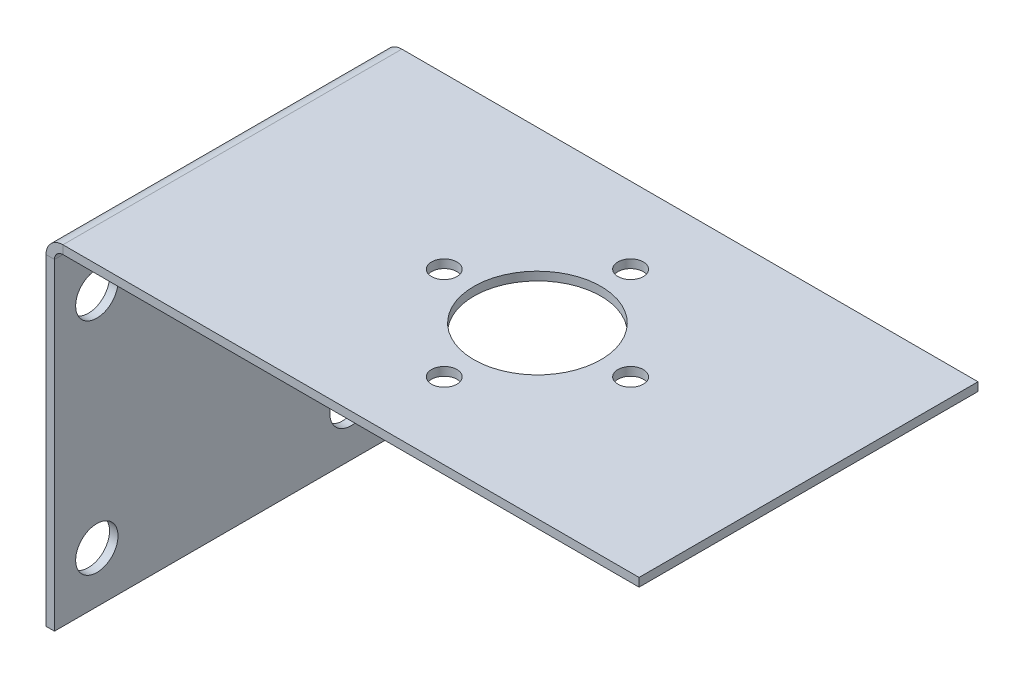
ISO-10303-21;
HEADER;
FILE_DESCRIPTION(('STEP AP214'),'2;1');
FILE_NAME('part.step','',(''),(''),'','','');
FILE_SCHEMA(('AUTOMOTIVE_DESIGN { 1 0 10303 214 1 1 1 1 }'));
ENDSEC;
DATA;
#1=APPLICATION_CONTEXT('core data for automotive mechanical design processes');
#2=APPLICATION_PROTOCOL_DEFINITION('international standard','automotive_design',2000,#1);
#3=PRODUCT_CONTEXT('',#1,'mechanical');
#4=PRODUCT('Part','Part','',(#3));
#5=PRODUCT_RELATED_PRODUCT_CATEGORY('part','',(#4));
#6=PRODUCT_DEFINITION_FORMATION('','',#4);
#7=PRODUCT_DEFINITION_CONTEXT('part definition',#1,'design');
#8=PRODUCT_DEFINITION('design','',#6,#7);
#9=PRODUCT_DEFINITION_SHAPE('','',#8);
#10=(LENGTH_UNIT() NAMED_UNIT(*) SI_UNIT(.MILLI.,.METRE.));
#11=(NAMED_UNIT(*) PLANE_ANGLE_UNIT() SI_UNIT($,.RADIAN.));
#12=(NAMED_UNIT(*) SI_UNIT($,.STERADIAN.) SOLID_ANGLE_UNIT());
#13=UNCERTAINTY_MEASURE_WITH_UNIT(LENGTH_MEASURE(1.E-05),#10,'distance_accuracy_value','');
#14=(GEOMETRIC_REPRESENTATION_CONTEXT(3) GLOBAL_UNCERTAINTY_ASSIGNED_CONTEXT((#13)) GLOBAL_UNIT_ASSIGNED_CONTEXT((#10,
#11,#12)) REPRESENTATION_CONTEXT('',''));
#15=CARTESIAN_POINT('',(0.,0.,0.));
#16=DIRECTION('',(0.,0.,1.));
#17=DIRECTION('',(1.,0.,0.));
#18=AXIS2_PLACEMENT_3D('',#15,#16,#17);
#19=CARTESIAN_POINT('',(2.,40.,40.));
#20=DIRECTION('',(0.,0.,1.));
#21=DIRECTION('',(1.,0.,0.));
#22=AXIS2_PLACEMENT_3D('',#19,#20,#21);
#23=PLANE('',#22);
#24=DIRECTION('',(0.,-1.,0.));
#25=VECTOR('',#24,1.);
#26=CARTESIAN_POINT('',(2.,40.,40.));
#27=LINE('',#26,#25);
#28=CARTESIAN_POINT('',(2.,40.,40.));
#29=VERTEX_POINT('',#28);
#30=CARTESIAN_POINT('',(2.,39.,40.));
#31=VERTEX_POINT('',#30);
#32=EDGE_CURVE('E11',#29,#31,#27,.T.);
#33=ORIENTED_EDGE('',*,*,#32,.F.);
#34=CARTESIAN_POINT('',(2.,38.,40.));
#35=DIRECTION('',(0.,0.,1.));
#36=DIRECTION('',(1.,0.,0.));
#37=AXIS2_PLACEMENT_3D('',#34,#35,#36);
#38=CIRCLE('',#37,2.);
#39=CARTESIAN_POINT('',(0.,38.,40.));
#40=VERTEX_POINT('',#39);
#41=EDGE_CURVE('E139',#40,#29,#38,.F.);
#42=ORIENTED_EDGE('',*,*,#41,.F.);
#43=DIRECTION('',(-1.,0.,0.));
#44=VECTOR('',#43,1.);
#45=CARTESIAN_POINT('',(1.,38.,40.));
#46=LINE('',#45,#44);
#47=CARTESIAN_POINT('',(1.,38.,40.));
#48=VERTEX_POINT('',#47);
#49=EDGE_CURVE('E50',#48,#40,#46,.T.);
#50=ORIENTED_EDGE('',*,*,#49,.F.);
#51=CARTESIAN_POINT('',(2.,38.,40.));
#52=DIRECTION('',(0.,0.,1.));
#53=DIRECTION('',(1.,0.,0.));
#54=AXIS2_PLACEMENT_3D('',#51,#52,#53);
#55=CIRCLE('',#54,1.);
#56=EDGE_CURVE('E132',#48,#31,#55,.F.);
#57=ORIENTED_EDGE('',*,*,#56,.T.);
#58=EDGE_LOOP('',(#33,#42,#50,#57));
#59=FACE_BOUND('',#58,.T.);
#60=ADVANCED_FACE('F42',(#59),#23,.T.);
#61=CARTESIAN_POINT('',(1.,38.,40.));
#62=DIRECTION('',(0.,0.,1.));
#63=DIRECTION('',(1.,0.,0.));
#64=AXIS2_PLACEMENT_3D('',#61,#62,#63);
#65=PLANE('',#64);
#66=DIRECTION('',(1.,0.,0.));
#67=VECTOR('',#66,1.);
#68=CARTESIAN_POINT('',(0.,40.,40.));
#69=LINE('',#68,#67);
#70=CARTESIAN_POINT('',(70.,40.,40.));
#71=VERTEX_POINT('',#70);
#72=EDGE_CURVE('E189',#29,#71,#69,.T.);
#73=ORIENTED_EDGE('',*,*,#72,.F.);
#74=ORIENTED_EDGE('',*,*,#32,.T.);
#75=DIRECTION('',(1.,0.,0.));
#76=VECTOR('',#75,1.);
#77=CARTESIAN_POINT('',(0.,39.,40.));
#78=LINE('',#77,#76);
#79=CARTESIAN_POINT('',(70.,39.,40.));
#80=VERTEX_POINT('',#79);
#81=EDGE_CURVE('E98',#31,#80,#78,.T.);
#82=ORIENTED_EDGE('',*,*,#81,.T.);
#83=DIRECTION('',(0.,-1.,0.));
#84=VECTOR('',#83,1.);
#85=CARTESIAN_POINT('',(70.,40.,40.));
#86=LINE('',#85,#84);
#87=EDGE_CURVE('E505',#71,#80,#86,.T.);
#88=ORIENTED_EDGE('',*,*,#87,.F.);
#89=EDGE_LOOP('',(#73,#74,#82,#88));
#90=FACE_BOUND('',#89,.T.);
#91=ADVANCED_FACE('F197',(#90),#65,.T.);
#92=CARTESIAN_POINT('',(0.,38.,0.));
#93=DIRECTION('',(0.,0.,-1.));
#94=DIRECTION('',(-1.,0.,0.));
#95=AXIS2_PLACEMENT_3D('',#92,#93,#94);
#96=PLANE('',#95);
#97=DIRECTION('',(1.,0.,0.));
#98=VECTOR('',#97,1.);
#99=CARTESIAN_POINT('',(0.,38.,0.));
#100=LINE('',#99,#98);
#101=CARTESIAN_POINT('',(0.,38.,0.));
#102=VERTEX_POINT('',#101);
#103=CARTESIAN_POINT('',(1.,38.,0.));
#104=VERTEX_POINT('',#103);
#105=EDGE_CURVE('E85',#102,#104,#100,.T.);
#106=ORIENTED_EDGE('',*,*,#105,.F.);
#107=CARTESIAN_POINT('',(2.,38.,0.));
#108=DIRECTION('',(0.,0.,1.));
#109=DIRECTION('',(1.,0.,0.));
#110=AXIS2_PLACEMENT_3D('',#107,#108,#109);
#111=CIRCLE('',#110,2.);
#112=CARTESIAN_POINT('',(2.,40.,0.));
#113=VERTEX_POINT('',#112);
#114=EDGE_CURVE('E155',#102,#113,#111,.F.);
#115=ORIENTED_EDGE('',*,*,#114,.T.);
#116=DIRECTION('',(0.,1.,0.));
#117=VECTOR('',#116,1.);
#118=CARTESIAN_POINT('',(2.,39.,0.));
#119=LINE('',#118,#117);
#120=CARTESIAN_POINT('',(2.,39.,0.));
#121=VERTEX_POINT('',#120);
#122=EDGE_CURVE('E92',#121,#113,#119,.T.);
#123=ORIENTED_EDGE('',*,*,#122,.F.);
#124=CARTESIAN_POINT('',(2.,38.,0.));
#125=DIRECTION('',(0.,0.,1.));
#126=DIRECTION('',(1.,0.,0.));
#127=AXIS2_PLACEMENT_3D('',#124,#125,#126);
#128=CIRCLE('',#127,1.);
#129=EDGE_CURVE('E162',#104,#121,#128,.F.);
#130=ORIENTED_EDGE('',*,*,#129,.F.);
#131=EDGE_LOOP('',(#106,#115,#123,#130));
#132=FACE_BOUND('',#131,.T.);
#133=ADVANCED_FACE('F195',(#132),#96,.T.);
#134=CARTESIAN_POINT('',(2.,39.,0.));
#135=DIRECTION('',(0.,0.,-1.));
#136=DIRECTION('',(-1.,0.,0.));
#137=AXIS2_PLACEMENT_3D('',#134,#135,#136);
#138=PLANE('',#137);
#139=DIRECTION('',(0.,1.,0.));
#140=VECTOR('',#139,1.);
#141=CARTESIAN_POINT('',(0.,0.,0.));
#142=LINE('',#141,#140);
#143=CARTESIAN_POINT('',(0.,0.,0.));
#144=VERTEX_POINT('',#143);
#145=EDGE_CURVE('E157',#144,#102,#142,.T.);
#146=ORIENTED_EDGE('',*,*,#145,.T.);
#147=ORIENTED_EDGE('',*,*,#105,.T.);
#148=DIRECTION('',(0.,1.,0.));
#149=VECTOR('',#148,1.);
#150=CARTESIAN_POINT('',(1.,0.,0.));
#151=LINE('',#150,#149);
#152=CARTESIAN_POINT('',(1.,0.,0.));
#153=VERTEX_POINT('',#152);
#154=EDGE_CURVE('E160',#153,#104,#151,.T.);
#155=ORIENTED_EDGE('',*,*,#154,.F.);
#156=DIRECTION('',(-1.,0.,0.));
#157=VECTOR('',#156,1.);
#158=CARTESIAN_POINT('',(1.,0.,0.));
#159=LINE('',#158,#157);
#160=EDGE_CURVE('E120',#153,#144,#159,.T.);
#161=ORIENTED_EDGE('',*,*,#160,.T.);
#162=EDGE_LOOP('',(#146,#147,#155,#161));
#163=FACE_BOUND('',#162,.T.);
#164=ADVANCED_FACE('F191',(#163),#138,.T.);
#165=CARTESIAN_POINT('',(0.,39.,40.));
#166=DIRECTION('',(0.,1.,0.));
#167=DIRECTION('',(0.,0.,1.));
#168=AXIS2_PLACEMENT_3D('',#165,#166,#167);
#169=PLANE('',#168);
#170=CARTESIAN_POINT('',(27.,39.,20.));
#171=DIRECTION('',(0.,1.,0.));
#172=DIRECTION('',(0.,0.,1.));
#173=AXIS2_PLACEMENT_3D('',#170,#171,#172);
#174=CIRCLE('',#173,1.5);
#175=CARTESIAN_POINT('',(27.,39.,21.5));
#176=VERTEX_POINT('',#175);
#177=EDGE_CURVE('E496',#176,#176,#174,.T.);
#178=ORIENTED_EDGE('',*,*,#177,.T.);
#179=EDGE_LOOP('',(#178));
#180=FACE_BOUND('',#179,.T.);
#181=CARTESIAN_POINT('',(38.,39.,8.99999999999999));
#182=DIRECTION('',(0.,1.,0.));
#183=DIRECTION('',(0.,0.,1.));
#184=AXIS2_PLACEMENT_3D('',#181,#182,#183);
#185=CIRCLE('',#184,1.5);
#186=CARTESIAN_POINT('',(38.,39.,10.5));
#187=VERTEX_POINT('',#186);
#188=EDGE_CURVE('E493',#187,#187,#185,.T.);
#189=ORIENTED_EDGE('',*,*,#188,.T.);
#190=EDGE_LOOP('',(#189));
#191=FACE_BOUND('',#190,.T.);
#192=CARTESIAN_POINT('',(49.,39.,20.));
#193=DIRECTION('',(0.,1.,0.));
#194=DIRECTION('',(0.,0.,1.));
#195=AXIS2_PLACEMENT_3D('',#192,#193,#194);
#196=CIRCLE('',#195,1.5);
#197=CARTESIAN_POINT('',(49.,39.,21.5));
#198=VERTEX_POINT('',#197);
#199=EDGE_CURVE('E490',#198,#198,#196,.T.);
#200=ORIENTED_EDGE('',*,*,#199,.T.);
#201=EDGE_LOOP('',(#200));
#202=FACE_BOUND('',#201,.T.);
#203=CARTESIAN_POINT('',(38.,39.,31.));
#204=DIRECTION('',(0.,1.,0.));
#205=DIRECTION('',(0.,0.,1.));
#206=AXIS2_PLACEMENT_3D('',#203,#204,#205);
#207=CIRCLE('',#206,1.5);
#208=CARTESIAN_POINT('',(38.,39.,32.5));
#209=VERTEX_POINT('',#208);
#210=EDGE_CURVE('E479',#209,#209,#207,.T.);
#211=ORIENTED_EDGE('',*,*,#210,.T.);
#212=EDGE_LOOP('',(#211));
#213=FACE_BOUND('',#212,.T.);
#214=CARTESIAN_POINT('',(38.,39.,20.));
#215=DIRECTION('',(0.,1.,0.));
#216=DIRECTION('',(0.,0.,1.));
#217=AXIS2_PLACEMENT_3D('',#214,#215,#216);
#218=CIRCLE('',#217,7.5);
#219=CARTESIAN_POINT('',(38.,39.,27.5));
#220=VERTEX_POINT('',#219);
#221=EDGE_CURVE('E149',#220,#220,#218,.F.);
#222=ORIENTED_EDGE('',*,*,#221,.F.);
#223=EDGE_LOOP('',(#222));
#224=FACE_BOUND('',#223,.T.);
#225=DIRECTION('',(1.,0.,0.));
#226=VECTOR('',#225,1.);
#227=CARTESIAN_POINT('',(0.,39.,0.));
#228=LINE('',#227,#226);
#229=CARTESIAN_POINT('',(70.,39.,0.));
#230=VERTEX_POINT('',#229);
#231=EDGE_CURVE('E145',#121,#230,#228,.T.);
#232=ORIENTED_EDGE('',*,*,#231,.T.);
#233=DIRECTION('',(0.,0.,-1.));
#234=VECTOR('',#233,1.);
#235=CARTESIAN_POINT('',(70.,39.,40.));
#236=LINE('',#235,#234);
#237=EDGE_CURVE('E176',#80,#230,#236,.T.);
#238=ORIENTED_EDGE('',*,*,#237,.F.);
#239=ORIENTED_EDGE('',*,*,#81,.F.);
#240=DIRECTION('',(0.,0.,-1.));
#241=VECTOR('',#240,1.);
#242=CARTESIAN_POINT('',(2.,39.,40.));
#243=LINE('',#242,#241);
#244=EDGE_CURVE('E144',#31,#121,#243,.T.);
#245=ORIENTED_EDGE('',*,*,#244,.T.);
#246=EDGE_LOOP('',(#232,#238,#239,#245));
#247=FACE_BOUND('',#246,.T.);
#248=ADVANCED_FACE('F203',(#180,#191,#202,#213,#224,#247),#169,.F.);
#249=CARTESIAN_POINT('',(70.,40.,40.));
#250=DIRECTION('',(1.,0.,0.));
#251=DIRECTION('',(0.,0.,-1.));
#252=AXIS2_PLACEMENT_3D('',#249,#250,#251);
#253=PLANE('',#252);
#254=DIRECTION('',(0.,-1.,0.));
#255=VECTOR('',#254,1.);
#256=CARTESIAN_POINT('',(70.,40.,0.));
#257=LINE('',#256,#255);
#258=CARTESIAN_POINT('',(70.,40.,0.));
#259=VERTEX_POINT('',#258);
#260=EDGE_CURVE('E148',#259,#230,#257,.T.);
#261=ORIENTED_EDGE('',*,*,#260,.F.);
#262=DIRECTION('',(0.,0.,-1.));
#263=VECTOR('',#262,1.);
#264=CARTESIAN_POINT('',(70.,40.,40.));
#265=LINE('',#264,#263);
#266=EDGE_CURVE('E174',#71,#259,#265,.T.);
#267=ORIENTED_EDGE('',*,*,#266,.F.);
#268=ORIENTED_EDGE('',*,*,#87,.T.);
#269=ORIENTED_EDGE('',*,*,#237,.T.);
#270=EDGE_LOOP('',(#261,#267,#268,#269));
#271=FACE_BOUND('',#270,.T.);
#272=ADVANCED_FACE('F232',(#271),#253,.T.);
#273=CARTESIAN_POINT('',(0.,40.,40.));
#274=DIRECTION('',(0.,1.,0.));
#275=DIRECTION('',(0.,0.,1.));
#276=AXIS2_PLACEMENT_3D('',#273,#274,#275);
#277=PLANE('',#276);
#278=CARTESIAN_POINT('',(27.,40.,20.));
#279=DIRECTION('',(0.,1.,0.));
#280=DIRECTION('',(0.,0.,1.));
#281=AXIS2_PLACEMENT_3D('',#278,#279,#280);
#282=CIRCLE('',#281,1.5);
#283=CARTESIAN_POINT('',(27.,40.,21.5));
#284=VERTEX_POINT('',#283);
#285=EDGE_CURVE('E476',#284,#284,#282,.T.);
#286=ORIENTED_EDGE('',*,*,#285,.F.);
#287=EDGE_LOOP('',(#286));
#288=FACE_BOUND('',#287,.T.);
#289=CARTESIAN_POINT('',(38.,40.,8.99999999999999));
#290=DIRECTION('',(0.,1.,0.));
#291=DIRECTION('',(0.,0.,1.));
#292=AXIS2_PLACEMENT_3D('',#289,#290,#291);
#293=CIRCLE('',#292,1.5);
#294=CARTESIAN_POINT('',(38.,40.,10.5));
#295=VERTEX_POINT('',#294);
#296=EDGE_CURVE('E480',#295,#295,#293,.T.);
#297=ORIENTED_EDGE('',*,*,#296,.F.);
#298=EDGE_LOOP('',(#297));
#299=FACE_BOUND('',#298,.T.);
#300=CARTESIAN_POINT('',(49.,40.,20.));
#301=DIRECTION('',(0.,1.,0.));
#302=DIRECTION('',(0.,0.,1.));
#303=AXIS2_PLACEMENT_3D('',#300,#301,#302);
#304=CIRCLE('',#303,1.5);
#305=CARTESIAN_POINT('',(49.,40.,21.5));
#306=VERTEX_POINT('',#305);
#307=EDGE_CURVE('E483',#306,#306,#304,.T.);
#308=ORIENTED_EDGE('',*,*,#307,.F.);
#309=EDGE_LOOP('',(#308));
#310=FACE_BOUND('',#309,.T.);
#311=CARTESIAN_POINT('',(38.,40.,31.));
#312=DIRECTION('',(0.,1.,0.));
#313=DIRECTION('',(0.,0.,1.));
#314=AXIS2_PLACEMENT_3D('',#311,#312,#313);
#315=CIRCLE('',#314,1.5);
#316=CARTESIAN_POINT('',(38.,40.,32.5));
#317=VERTEX_POINT('',#316);
#318=EDGE_CURVE('E475',#317,#317,#315,.T.);
#319=ORIENTED_EDGE('',*,*,#318,.F.);
#320=EDGE_LOOP('',(#319));
#321=FACE_BOUND('',#320,.T.);
#322=CARTESIAN_POINT('',(38.,40.,20.));
#323=DIRECTION('',(0.,1.,0.));
#324=DIRECTION('',(0.,0.,1.));
#325=AXIS2_PLACEMENT_3D('',#322,#323,#324);
#326=CIRCLE('',#325,7.5);
#327=CARTESIAN_POINT('',(38.,40.,27.5));
#328=VERTEX_POINT('',#327);
#329=EDGE_CURVE('E499',#328,#328,#326,.T.);
#330=ORIENTED_EDGE('',*,*,#329,.F.);
#331=EDGE_LOOP('',(#330));
#332=FACE_BOUND('',#331,.T.);
#333=DIRECTION('',(1.,0.,0.));
#334=VECTOR('',#333,1.);
#335=CARTESIAN_POINT('',(0.,40.,0.));
#336=LINE('',#335,#334);
#337=EDGE_CURVE('E152',#113,#259,#336,.T.);
#338=ORIENTED_EDGE('',*,*,#337,.F.);
#339=DIRECTION('',(0.,0.,-1.));
#340=VECTOR('',#339,1.);
#341=CARTESIAN_POINT('',(2.,40.,40.));
#342=LINE('',#341,#340);
#343=EDGE_CURVE('E171',#29,#113,#342,.T.);
#344=ORIENTED_EDGE('',*,*,#343,.F.);
#345=ORIENTED_EDGE('',*,*,#72,.T.);
#346=ORIENTED_EDGE('',*,*,#266,.T.);
#347=EDGE_LOOP('',(#338,#344,#345,#346));
#348=FACE_BOUND('',#347,.T.);
#349=ADVANCED_FACE('F237',(#288,#299,#310,#321,#332,#348),#277,.T.);
#350=CARTESIAN_POINT('',(2.,38.,40.));
#351=DIRECTION('',(0.,0.,-1.));
#352=DIRECTION('',(-1.,0.,0.));
#353=AXIS2_PLACEMENT_3D('',#350,#351,#352);
#354=CYLINDRICAL_SURFACE('',#353,2.);
#355=ORIENTED_EDGE('',*,*,#114,.F.);
#356=DIRECTION('',(0.,0.,-1.));
#357=VECTOR('',#356,1.);
#358=CARTESIAN_POINT('',(0.,38.,40.));
#359=LINE('',#358,#357);
#360=EDGE_CURVE('E168',#40,#102,#359,.T.);
#361=ORIENTED_EDGE('',*,*,#360,.F.);
#362=ORIENTED_EDGE('',*,*,#41,.T.);
#363=ORIENTED_EDGE('',*,*,#343,.T.);
#364=EDGE_LOOP('',(#355,#361,#362,#363));
#365=FACE_BOUND('',#364,.T.);
#366=ADVANCED_FACE('F185',(#365),#354,.T.);
#367=CARTESIAN_POINT('',(0.,0.,40.));
#368=DIRECTION('',(-1.,0.,0.));
#369=DIRECTION('',(0.,0.,1.));
#370=AXIS2_PLACEMENT_3D('',#367,#368,#369);
#371=PLANE('',#370);
#372=CARTESIAN_POINT('',(0.,32.,35.));
#373=DIRECTION('',(-1.,0.,0.));
#374=DIRECTION('',(0.,0.,-1.));
#375=AXIS2_PLACEMENT_3D('',#372,#373,#374);
#376=CIRCLE('',#375,2.5);
#377=CARTESIAN_POINT('',(0.,32.,32.5));
#378=VERTEX_POINT('',#377);
#379=EDGE_CURVE('E456',#378,#378,#376,.T.);
#380=ORIENTED_EDGE('',*,*,#379,.F.);
#381=EDGE_LOOP('',(#380));
#382=FACE_BOUND('',#381,.T.);
#383=CARTESIAN_POINT('',(0.,5.99999999999999,35.));
#384=DIRECTION('',(-1.,0.,0.));
#385=DIRECTION('',(0.,0.,1.));
#386=AXIS2_PLACEMENT_3D('',#383,#384,#385);
#387=CIRCLE('',#386,2.5);
#388=CARTESIAN_POINT('',(0.,5.99999999999999,37.5));
#389=VERTEX_POINT('',#388);
#390=EDGE_CURVE('E460',#389,#389,#387,.T.);
#391=ORIENTED_EDGE('',*,*,#390,.F.);
#392=EDGE_LOOP('',(#391));
#393=FACE_BOUND('',#392,.T.);
#394=CARTESIAN_POINT('',(0.,5.99999999999999,5.));
#395=DIRECTION('',(-1.,0.,0.));
#396=DIRECTION('',(0.,0.,-1.));
#397=AXIS2_PLACEMENT_3D('',#394,#395,#396);
#398=CIRCLE('',#397,2.5);
#399=CARTESIAN_POINT('',(0.,5.99999999999999,2.5));
#400=VERTEX_POINT('',#399);
#401=EDGE_CURVE('E542',#400,#400,#398,.T.);
#402=ORIENTED_EDGE('',*,*,#401,.F.);
#403=EDGE_LOOP('',(#402));
#404=FACE_BOUND('',#403,.T.);
#405=CARTESIAN_POINT('',(0.,32.,5.));
#406=DIRECTION('',(-1.,0.,0.));
#407=DIRECTION('',(0.,0.,1.));
#408=AXIS2_PLACEMENT_3D('',#405,#406,#407);
#409=CIRCLE('',#408,2.5);
#410=CARTESIAN_POINT('',(0.,32.,7.5));
#411=VERTEX_POINT('',#410);
#412=EDGE_CURVE('E468',#411,#411,#409,.T.);
#413=ORIENTED_EDGE('',*,*,#412,.F.);
#414=EDGE_LOOP('',(#413));
#415=FACE_BOUND('',#414,.T.);
#416=ORIENTED_EDGE('',*,*,#145,.F.);
#417=DIRECTION('',(0.,0.,-1.));
#418=VECTOR('',#417,1.);
#419=CARTESIAN_POINT('',(0.,0.,40.));
#420=LINE('',#419,#418);
#421=CARTESIAN_POINT('',(0.,0.,40.));
#422=VERTEX_POINT('',#421);
#423=EDGE_CURVE('E122',#422,#144,#420,.T.);
#424=ORIENTED_EDGE('',*,*,#423,.F.);
#425=DIRECTION('',(0.,1.,0.));
#426=VECTOR('',#425,1.);
#427=CARTESIAN_POINT('',(0.,0.,40.));
#428=LINE('',#427,#426);
#429=EDGE_CURVE('E137',#422,#40,#428,.T.);
#430=ORIENTED_EDGE('',*,*,#429,.T.);
#431=ORIENTED_EDGE('',*,*,#360,.T.);
#432=EDGE_LOOP('',(#416,#424,#430,#431));
#433=FACE_BOUND('',#432,.T.);
#434=ADVANCED_FACE('F190',(#382,#393,#404,#415,#433),#371,.T.);
#435=CARTESIAN_POINT('',(1.,0.,40.));
#436=DIRECTION('',(0.,-1.,0.));
#437=DIRECTION('',(0.,0.,-1.));
#438=AXIS2_PLACEMENT_3D('',#435,#436,#437);
#439=PLANE('',#438);
#440=ORIENTED_EDGE('',*,*,#160,.F.);
#441=DIRECTION('',(0.,0.,-1.));
#442=VECTOR('',#441,1.);
#443=CARTESIAN_POINT('',(1.,0.,40.));
#444=LINE('',#443,#442);
#445=CARTESIAN_POINT('',(1.,0.,40.));
#446=VERTEX_POINT('',#445);
#447=EDGE_CURVE('E114',#446,#153,#444,.T.);
#448=ORIENTED_EDGE('',*,*,#447,.F.);
#449=DIRECTION('',(-1.,0.,0.));
#450=VECTOR('',#449,1.);
#451=CARTESIAN_POINT('',(1.,0.,40.));
#452=LINE('',#451,#450);
#453=EDGE_CURVE('E118',#446,#422,#452,.T.);
#454=ORIENTED_EDGE('',*,*,#453,.T.);
#455=ORIENTED_EDGE('',*,*,#423,.T.);
#456=EDGE_LOOP('',(#440,#448,#454,#455));
#457=FACE_BOUND('',#456,.T.);
#458=ADVANCED_FACE('F116',(#457),#439,.T.);
#459=CARTESIAN_POINT('',(1.,0.,40.));
#460=DIRECTION('',(-1.,0.,0.));
#461=DIRECTION('',(0.,0.,1.));
#462=AXIS2_PLACEMENT_3D('',#459,#460,#461);
#463=PLANE('',#462);
#464=CARTESIAN_POINT('',(1.,32.,35.));
#465=DIRECTION('',(-1.,0.,0.));
#466=DIRECTION('',(0.,0.,1.));
#467=AXIS2_PLACEMENT_3D('',#464,#465,#466);
#468=CIRCLE('',#467,2.5);
#469=CARTESIAN_POINT('',(1.,32.,37.5));
#470=VERTEX_POINT('',#469);
#471=EDGE_CURVE('E459',#470,#470,#468,.F.);
#472=ORIENTED_EDGE('',*,*,#471,.F.);
#473=EDGE_LOOP('',(#472));
#474=FACE_BOUND('',#473,.T.);
#475=CARTESIAN_POINT('',(1.,5.99999999999999,35.));
#476=DIRECTION('',(-1.,0.,0.));
#477=DIRECTION('',(0.,0.,1.));
#478=AXIS2_PLACEMENT_3D('',#475,#476,#477);
#479=CIRCLE('',#478,2.5);
#480=CARTESIAN_POINT('',(1.,5.99999999999999,37.5));
#481=VERTEX_POINT('',#480);
#482=EDGE_CURVE('E463',#481,#481,#479,.F.);
#483=ORIENTED_EDGE('',*,*,#482,.F.);
#484=EDGE_LOOP('',(#483));
#485=FACE_BOUND('',#484,.T.);
#486=CARTESIAN_POINT('',(1.,5.99999999999999,5.));
#487=DIRECTION('',(-1.,0.,0.));
#488=DIRECTION('',(0.,0.,1.));
#489=AXIS2_PLACEMENT_3D('',#486,#487,#488);
#490=CIRCLE('',#489,2.5);
#491=CARTESIAN_POINT('',(1.,5.99999999999999,7.50000000000001));
#492=VERTEX_POINT('',#491);
#493=EDGE_CURVE('E472',#492,#492,#490,.F.);
#494=ORIENTED_EDGE('',*,*,#493,.F.);
#495=EDGE_LOOP('',(#494));
#496=FACE_BOUND('',#495,.T.);
#497=CARTESIAN_POINT('',(1.,32.,5.));
#498=DIRECTION('',(-1.,0.,0.));
#499=DIRECTION('',(0.,0.,1.));
#500=AXIS2_PLACEMENT_3D('',#497,#498,#499);
#501=CIRCLE('',#500,2.5);
#502=CARTESIAN_POINT('',(1.,32.,7.5));
#503=VERTEX_POINT('',#502);
#504=EDGE_CURVE('E471',#503,#503,#501,.F.);
#505=ORIENTED_EDGE('',*,*,#504,.F.);
#506=EDGE_LOOP('',(#505));
#507=FACE_BOUND('',#506,.T.);
#508=ORIENTED_EDGE('',*,*,#154,.T.);
#509=DIRECTION('',(0.,0.,-1.));
#510=VECTOR('',#509,1.);
#511=CARTESIAN_POINT('',(1.,38.,40.));
#512=LINE('',#511,#510);
#513=EDGE_CURVE('E123',#48,#104,#512,.T.);
#514=ORIENTED_EDGE('',*,*,#513,.F.);
#515=DIRECTION('',(0.,1.,0.));
#516=VECTOR('',#515,1.);
#517=CARTESIAN_POINT('',(1.,0.,40.));
#518=LINE('',#517,#516);
#519=EDGE_CURVE('E127',#446,#48,#518,.T.);
#520=ORIENTED_EDGE('',*,*,#519,.F.);
#521=ORIENTED_EDGE('',*,*,#447,.T.);
#522=EDGE_LOOP('',(#508,#514,#520,#521));
#523=FACE_BOUND('',#522,.T.);
#524=ADVANCED_FACE('F128',(#474,#485,#496,#507,#523),#463,.F.);
#525=CARTESIAN_POINT('',(2.,38.,40.));
#526=DIRECTION('',(0.,0.,-1.));
#527=DIRECTION('',(-1.,0.,0.));
#528=AXIS2_PLACEMENT_3D('',#525,#526,#527);
#529=CYLINDRICAL_SURFACE('',#528,1.);
#530=ORIENTED_EDGE('',*,*,#129,.T.);
#531=ORIENTED_EDGE('',*,*,#244,.F.);
#532=ORIENTED_EDGE('',*,*,#56,.F.);
#533=ORIENTED_EDGE('',*,*,#513,.T.);
#534=EDGE_LOOP('',(#530,#531,#532,#533));
#535=FACE_BOUND('',#534,.T.);
#536=ADVANCED_FACE('F193',(#535),#529,.F.);
#537=CARTESIAN_POINT('',(2.,38.,40.));
#538=DIRECTION('',(0.,0.,1.));
#539=DIRECTION('',(1.,0.,0.));
#540=AXIS2_PLACEMENT_3D('',#537,#538,#539);
#541=PLANE('',#540);
#542=ORIENTED_EDGE('',*,*,#519,.T.);
#543=ORIENTED_EDGE('',*,*,#49,.T.);
#544=ORIENTED_EDGE('',*,*,#429,.F.);
#545=ORIENTED_EDGE('',*,*,#453,.F.);
#546=EDGE_LOOP('',(#542,#543,#544,#545));
#547=FACE_BOUND('',#546,.T.);
#548=ADVANCED_FACE('F135',(#547),#541,.T.);
#549=CARTESIAN_POINT('',(2.,38.,0.));
#550=DIRECTION('',(0.,0.,1.));
#551=DIRECTION('',(1.,0.,0.));
#552=AXIS2_PLACEMENT_3D('',#549,#550,#551);
#553=PLANE('',#552);
#554=ORIENTED_EDGE('',*,*,#231,.F.);
#555=ORIENTED_EDGE('',*,*,#122,.T.);
#556=ORIENTED_EDGE('',*,*,#337,.T.);
#557=ORIENTED_EDGE('',*,*,#260,.T.);
#558=EDGE_LOOP('',(#554,#555,#556,#557));
#559=FACE_BOUND('',#558,.T.);
#560=ADVANCED_FACE('F281',(#559),#553,.F.);
#561=CARTESIAN_POINT('',(38.,-0.001000000000001,20.));
#562=DIRECTION('',(0.,1.,0.));
#563=DIRECTION('',(0.,0.,1.));
#564=AXIS2_PLACEMENT_3D('',#561,#562,#563);
#565=CYLINDRICAL_SURFACE('',#564,7.5);
#566=ORIENTED_EDGE('',*,*,#329,.T.);
#567=EDGE_LOOP('',(#566));
#568=FACE_BOUND('',#567,.T.);
#569=ORIENTED_EDGE('',*,*,#221,.T.);
#570=EDGE_LOOP('',(#569));
#571=FACE_BOUND('',#570,.T.);
#572=ADVANCED_FACE('F291',(#568,#571),#565,.F.);
#573=CARTESIAN_POINT('',(38.,0.,31.));
#574=DIRECTION('',(0.,1.,0.));
#575=DIRECTION('',(0.,0.,1.));
#576=AXIS2_PLACEMENT_3D('',#573,#574,#575);
#577=CYLINDRICAL_SURFACE('',#576,1.5);
#578=ORIENTED_EDGE('',*,*,#318,.T.);
#579=EDGE_LOOP('',(#578));
#580=FACE_BOUND('',#579,.T.);
#581=ORIENTED_EDGE('',*,*,#210,.F.);
#582=EDGE_LOOP('',(#581));
#583=FACE_BOUND('',#582,.T.);
#584=ADVANCED_FACE('F302',(#580,#583),#577,.F.);
#585=CARTESIAN_POINT('',(49.,0.,20.));
#586=DIRECTION('',(0.,1.,0.));
#587=DIRECTION('',(0.,0.,1.));
#588=AXIS2_PLACEMENT_3D('',#585,#586,#587);
#589=CYLINDRICAL_SURFACE('',#588,1.5);
#590=ORIENTED_EDGE('',*,*,#307,.T.);
#591=EDGE_LOOP('',(#590));
#592=FACE_BOUND('',#591,.T.);
#593=ORIENTED_EDGE('',*,*,#199,.F.);
#594=EDGE_LOOP('',(#593));
#595=FACE_BOUND('',#594,.T.);
#596=ADVANCED_FACE('F329',(#592,#595),#589,.F.);
#597=CARTESIAN_POINT('',(38.,0.,8.99999999999999));
#598=DIRECTION('',(0.,1.,0.));
#599=DIRECTION('',(0.,0.,1.));
#600=AXIS2_PLACEMENT_3D('',#597,#598,#599);
#601=CYLINDRICAL_SURFACE('',#600,1.5);
#602=ORIENTED_EDGE('',*,*,#296,.T.);
#603=EDGE_LOOP('',(#602));
#604=FACE_BOUND('',#603,.T.);
#605=ORIENTED_EDGE('',*,*,#188,.F.);
#606=EDGE_LOOP('',(#605));
#607=FACE_BOUND('',#606,.T.);
#608=ADVANCED_FACE('F340',(#604,#607),#601,.F.);
#609=CARTESIAN_POINT('',(27.,0.,20.));
#610=DIRECTION('',(0.,1.,0.));
#611=DIRECTION('',(0.,0.,1.));
#612=AXIS2_PLACEMENT_3D('',#609,#610,#611);
#613=CYLINDRICAL_SURFACE('',#612,1.5);
#614=ORIENTED_EDGE('',*,*,#285,.T.);
#615=EDGE_LOOP('',(#614));
#616=FACE_BOUND('',#615,.T.);
#617=ORIENTED_EDGE('',*,*,#177,.F.);
#618=EDGE_LOOP('',(#617));
#619=FACE_BOUND('',#618,.T.);
#620=ADVANCED_FACE('F351',(#616,#619),#613,.F.);
#621=CARTESIAN_POINT('',(70.001,32.,5.));
#622=DIRECTION('',(-1.,0.,0.));
#623=DIRECTION('',(0.,0.,1.));
#624=AXIS2_PLACEMENT_3D('',#621,#622,#623);
#625=CYLINDRICAL_SURFACE('',#624,2.5);
#626=ORIENTED_EDGE('',*,*,#412,.T.);
#627=EDGE_LOOP('',(#626));
#628=FACE_BOUND('',#627,.T.);
#629=ORIENTED_EDGE('',*,*,#504,.T.);
#630=EDGE_LOOP('',(#629));
#631=FACE_BOUND('',#630,.T.);
#632=ADVANCED_FACE('F362',(#628,#631),#625,.F.);
#633=CARTESIAN_POINT('',(70.001,5.99999999999999,5.));
#634=DIRECTION('',(-1.,0.,0.));
#635=DIRECTION('',(0.,0.,1.));
#636=AXIS2_PLACEMENT_3D('',#633,#634,#635);
#637=CYLINDRICAL_SURFACE('',#636,2.5);
#638=ORIENTED_EDGE('',*,*,#401,.T.);
#639=EDGE_LOOP('',(#638));
#640=FACE_BOUND('',#639,.T.);
#641=ORIENTED_EDGE('',*,*,#493,.T.);
#642=EDGE_LOOP('',(#641));
#643=FACE_BOUND('',#642,.T.);
#644=ADVANCED_FACE('F389',(#640,#643),#637,.F.);
#645=CARTESIAN_POINT('',(70.001,5.99999999999999,35.));
#646=DIRECTION('',(-1.,0.,0.));
#647=DIRECTION('',(0.,0.,1.));
#648=AXIS2_PLACEMENT_3D('',#645,#646,#647);
#649=CYLINDRICAL_SURFACE('',#648,2.5);
#650=ORIENTED_EDGE('',*,*,#390,.T.);
#651=EDGE_LOOP('',(#650));
#652=FACE_BOUND('',#651,.T.);
#653=ORIENTED_EDGE('',*,*,#482,.T.);
#654=EDGE_LOOP('',(#653));
#655=FACE_BOUND('',#654,.T.);
#656=ADVANCED_FACE('F400',(#652,#655),#649,.F.);
#657=CARTESIAN_POINT('',(70.001,32.,35.));
#658=DIRECTION('',(-1.,0.,0.));
#659=DIRECTION('',(0.,0.,1.));
#660=AXIS2_PLACEMENT_3D('',#657,#658,#659);
#661=CYLINDRICAL_SURFACE('',#660,2.5);
#662=ORIENTED_EDGE('',*,*,#379,.T.);
#663=EDGE_LOOP('',(#662));
#664=FACE_BOUND('',#663,.T.);
#665=ORIENTED_EDGE('',*,*,#471,.T.);
#666=EDGE_LOOP('',(#665));
#667=FACE_BOUND('',#666,.T.);
#668=ADVANCED_FACE('F411',(#664,#667),#661,.F.);
#669=CLOSED_SHELL('',(#60,#91,#133,#164,#248,#272,#349,#366,#434,#458,#524,#536,#548,#560,#572,
#584,#596,#608,#620,#632,#644,#656,#668));
#670=MANIFOLD_SOLID_BREP('B2',#669);
#671=ADVANCED_BREP_SHAPE_REPRESENTATION('',(#18,#670),#14);
#672=SHAPE_DEFINITION_REPRESENTATION(#9,#671);
ENDSEC;
END-ISO-10303-21;
